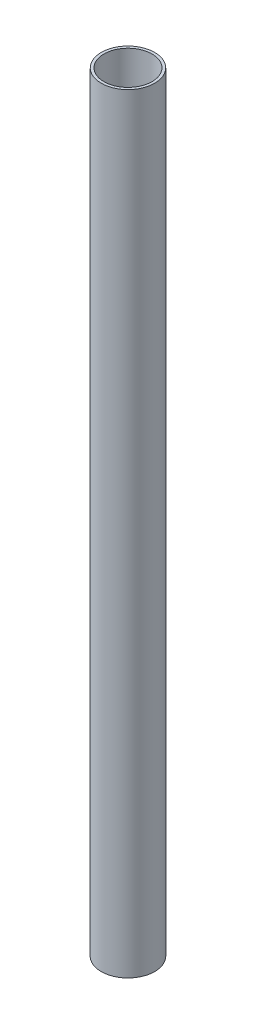
ISO-10303-21;
HEADER;
FILE_DESCRIPTION(('STEP AP214'),'2;1');
FILE_NAME('part.step','',(''),(''),'','','');
FILE_SCHEMA(('AUTOMOTIVE_DESIGN { 1 0 10303 214 1 1 1 1 }'));
ENDSEC;
DATA;
#1=APPLICATION_CONTEXT('core data for automotive mechanical design processes');
#2=APPLICATION_PROTOCOL_DEFINITION('international standard','automotive_design',2000,#1);
#3=PRODUCT_CONTEXT('',#1,'mechanical');
#4=PRODUCT('Part','Part','',(#3));
#5=PRODUCT_RELATED_PRODUCT_CATEGORY('part','',(#4));
#6=PRODUCT_DEFINITION_FORMATION('','',#4);
#7=PRODUCT_DEFINITION_CONTEXT('part definition',#1,'design');
#8=PRODUCT_DEFINITION('design','',#6,#7);
#9=PRODUCT_DEFINITION_SHAPE('','',#8);
#10=(LENGTH_UNIT() NAMED_UNIT(*) SI_UNIT(.MILLI.,.METRE.));
#11=(NAMED_UNIT(*) PLANE_ANGLE_UNIT() SI_UNIT($,.RADIAN.));
#12=(NAMED_UNIT(*) SI_UNIT($,.STERADIAN.) SOLID_ANGLE_UNIT());
#13=UNCERTAINTY_MEASURE_WITH_UNIT(LENGTH_MEASURE(1.E-05),#10,'distance_accuracy_value','');
#14=(GEOMETRIC_REPRESENTATION_CONTEXT(3) GLOBAL_UNCERTAINTY_ASSIGNED_CONTEXT((#13)) GLOBAL_UNIT_ASSIGNED_CONTEXT((#10,
#11,#12)) REPRESENTATION_CONTEXT('',''));
#15=CARTESIAN_POINT('',(0.,0.,0.));
#16=DIRECTION('',(0.,0.,1.));
#17=DIRECTION('',(1.,0.,0.));
#18=AXIS2_PLACEMENT_3D('',#15,#16,#17);
#19=CARTESIAN_POINT('',(0.,-914.4,0.));
#20=DIRECTION('',(0.,1.,0.));
#21=DIRECTION('',(0.,0.,1.));
#22=AXIS2_PLACEMENT_3D('',#19,#20,#21);
#23=CYLINDRICAL_SURFACE('',#22,31.75);
#24=CARTESIAN_POINT('',(0.,-914.4,0.));
#25=DIRECTION('',(0.,1.,0.));
#26=DIRECTION('',(0.,0.,1.));
#27=AXIS2_PLACEMENT_3D('',#24,#25,#26);
#28=CIRCLE('',#27,31.75);
#29=CARTESIAN_POINT('',(0.,-914.4,31.75));
#30=VERTEX_POINT('',#29);
#31=EDGE_CURVE('E10',#30,#30,#28,.T.);
#32=ORIENTED_EDGE('',*,*,#31,.T.);
#33=EDGE_LOOP('',(#32));
#34=FACE_BOUND('',#33,.T.);
#35=CARTESIAN_POINT('',(0.,0.,0.));
#36=DIRECTION('',(0.,1.,0.));
#37=DIRECTION('',(0.,0.,1.));
#38=AXIS2_PLACEMENT_3D('',#35,#36,#37);
#39=CIRCLE('',#38,31.75);
#40=CARTESIAN_POINT('',(0.,0.,31.75));
#41=VERTEX_POINT('',#40);
#42=EDGE_CURVE('E41',#41,#41,#39,.T.);
#43=ORIENTED_EDGE('',*,*,#42,.F.);
#44=EDGE_LOOP('',(#43));
#45=FACE_BOUND('',#44,.T.);
#46=ADVANCED_FACE('F38',(#34,#45),#23,.T.);
#47=CARTESIAN_POINT('',(0.,-914.4,0.));
#48=DIRECTION('',(0.,1.,0.));
#49=DIRECTION('',(0.,0.,1.));
#50=AXIS2_PLACEMENT_3D('',#47,#48,#49);
#51=PLANE('',#50);
#52=CARTESIAN_POINT('',(0.,-914.4,0.));
#53=DIRECTION('',(0.,1.,0.));
#54=DIRECTION('',(0.,0.,1.));
#55=AXIS2_PLACEMENT_3D('',#52,#53,#54);
#56=CIRCLE('',#55,28.575);
#57=CARTESIAN_POINT('',(0.,-914.4,28.575));
#58=VERTEX_POINT('',#57);
#59=EDGE_CURVE('E48',#58,#58,#56,.T.);
#60=ORIENTED_EDGE('',*,*,#59,.T.);
#61=EDGE_LOOP('',(#60));
#62=FACE_BOUND('',#61,.T.);
#63=ORIENTED_EDGE('',*,*,#31,.F.);
#64=EDGE_LOOP('',(#63));
#65=FACE_BOUND('',#64,.T.);
#66=ADVANCED_FACE('F56',(#62,#65),#51,.F.);
#67=CARTESIAN_POINT('',(0.,0.,0.));
#68=DIRECTION('',(0.,1.,0.));
#69=DIRECTION('',(0.,0.,1.));
#70=AXIS2_PLACEMENT_3D('',#67,#68,#69);
#71=PLANE('',#70);
#72=CARTESIAN_POINT('',(0.,0.,0.));
#73=DIRECTION('',(0.,1.,0.));
#74=DIRECTION('',(0.,0.,1.));
#75=AXIS2_PLACEMENT_3D('',#72,#73,#74);
#76=CIRCLE('',#75,28.575);
#77=CARTESIAN_POINT('',(0.,0.,28.575));
#78=VERTEX_POINT('',#77);
#79=EDGE_CURVE('E50',#78,#78,#76,.T.);
#80=ORIENTED_EDGE('',*,*,#79,.F.);
#81=EDGE_LOOP('',(#80));
#82=FACE_BOUND('',#81,.T.);
#83=ORIENTED_EDGE('',*,*,#42,.T.);
#84=EDGE_LOOP('',(#83));
#85=FACE_BOUND('',#84,.T.);
#86=ADVANCED_FACE('F62',(#82,#85),#71,.T.);
#87=CARTESIAN_POINT('',(0.,-914.4,0.));
#88=DIRECTION('',(0.,1.,0.));
#89=DIRECTION('',(0.,0.,1.));
#90=AXIS2_PLACEMENT_3D('',#87,#88,#89);
#91=CYLINDRICAL_SURFACE('',#90,28.575);
#92=ORIENTED_EDGE('',*,*,#59,.F.);
#93=EDGE_LOOP('',(#92));
#94=FACE_BOUND('',#93,.T.);
#95=ORIENTED_EDGE('',*,*,#79,.T.);
#96=EDGE_LOOP('',(#95));
#97=FACE_BOUND('',#96,.T.);
#98=ADVANCED_FACE('F59',(#94,#97),#91,.F.);
#99=CLOSED_SHELL('',(#46,#66,#86,#98));
#100=MANIFOLD_SOLID_BREP('B2',#99);
#101=ADVANCED_BREP_SHAPE_REPRESENTATION('',(#18,#100),#14);
#102=SHAPE_DEFINITION_REPRESENTATION(#9,#101);
ENDSEC;
END-ISO-10303-21;
